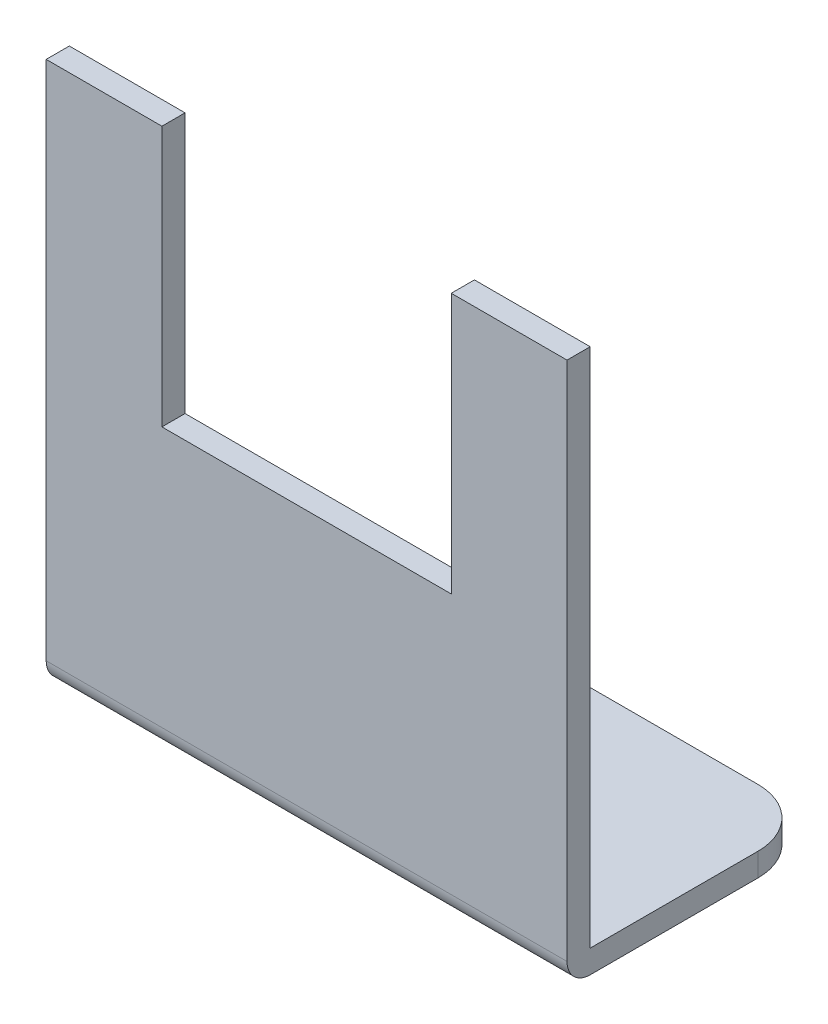
ISO-10303-21;
HEADER;
FILE_DESCRIPTION(('STEP AP214'),'2;1');
FILE_NAME('part.step','',(''),(''),'','','');
FILE_SCHEMA(('AUTOMOTIVE_DESIGN { 1 0 10303 214 1 1 1 1 }'));
ENDSEC;
DATA;
#1=APPLICATION_CONTEXT('core data for automotive mechanical design processes');
#2=APPLICATION_PROTOCOL_DEFINITION('international standard','automotive_design',2000,#1);
#3=PRODUCT_CONTEXT('',#1,'mechanical');
#4=PRODUCT('Part','Part','',(#3));
#5=PRODUCT_RELATED_PRODUCT_CATEGORY('part','',(#4));
#6=PRODUCT_DEFINITION_FORMATION('','',#4);
#7=PRODUCT_DEFINITION_CONTEXT('part definition',#1,'design');
#8=PRODUCT_DEFINITION('design','',#6,#7);
#9=PRODUCT_DEFINITION_SHAPE('','',#8);
#10=(LENGTH_UNIT() NAMED_UNIT(*) SI_UNIT(.MILLI.,.METRE.));
#11=(NAMED_UNIT(*) PLANE_ANGLE_UNIT() SI_UNIT($,.RADIAN.));
#12=(NAMED_UNIT(*) SI_UNIT($,.STERADIAN.) SOLID_ANGLE_UNIT());
#13=UNCERTAINTY_MEASURE_WITH_UNIT(LENGTH_MEASURE(1.E-05),#10,'distance_accuracy_value','');
#14=(GEOMETRIC_REPRESENTATION_CONTEXT(3) GLOBAL_UNCERTAINTY_ASSIGNED_CONTEXT((#13)) GLOBAL_UNIT_ASSIGNED_CONTEXT((#10,
#11,#12)) REPRESENTATION_CONTEXT('',''));
#15=CARTESIAN_POINT('',(0.,0.,0.));
#16=DIRECTION('',(0.,0.,1.));
#17=DIRECTION('',(1.,0.,0.));
#18=AXIS2_PLACEMENT_3D('',#15,#16,#17);
#19=CARTESIAN_POINT('',(0.,0.,0.));
#20=DIRECTION('',(0.,0.,1.));
#21=DIRECTION('',(1.,0.,0.));
#22=AXIS2_PLACEMENT_3D('',#19,#20,#21);
#23=PLANE('',#22);
#24=DIRECTION('',(0.,-1.,0.));
#25=VECTOR('',#24,1.);
#26=CARTESIAN_POINT('',(12.5,0.,0.));
#27=LINE('',#26,#25);
#28=CARTESIAN_POINT('',(12.5,23.5,0.));
#29=VERTEX_POINT('',#28);
#30=CARTESIAN_POINT('',(12.5,0.999999999999997,0.));
#31=VERTEX_POINT('',#30);
#32=EDGE_CURVE('E246',#29,#31,#27,.T.);
#33=ORIENTED_EDGE('',*,*,#32,.F.);
#34=DIRECTION('',(1.,0.,0.));
#35=VECTOR('',#34,1.);
#36=CARTESIAN_POINT('',(-22.5,23.5,0.));
#37=LINE('',#36,#35);
#38=CARTESIAN_POINT('',(22.5,23.5,0.));
#39=VERTEX_POINT('',#38);
#40=EDGE_CURVE('E148',#29,#39,#37,.T.);
#41=ORIENTED_EDGE('',*,*,#40,.T.);
#42=DIRECTION('',(0.,-1.,0.));
#43=VECTOR('',#42,1.);
#44=CARTESIAN_POINT('',(22.5,23.5,0.));
#45=LINE('',#44,#43);
#46=CARTESIAN_POINT('',(22.5,-21.5,0.));
#47=VERTEX_POINT('',#46);
#48=EDGE_CURVE('E167',#39,#47,#45,.T.);
#49=ORIENTED_EDGE('',*,*,#48,.T.);
#50=DIRECTION('',(1.,0.,0.));
#51=VECTOR('',#50,1.);
#52=CARTESIAN_POINT('',(22.5,-21.5,0.));
#53=LINE('',#52,#51);
#54=CARTESIAN_POINT('',(-22.5,-21.5,0.));
#55=VERTEX_POINT('',#54);
#56=EDGE_CURVE('E216',#55,#47,#53,.T.);
#57=ORIENTED_EDGE('',*,*,#56,.F.);
#58=DIRECTION('',(0.,-1.,0.));
#59=VECTOR('',#58,1.);
#60=CARTESIAN_POINT('',(-22.5,23.5,0.));
#61=LINE('',#60,#59);
#62=CARTESIAN_POINT('',(-22.5,23.5,0.));
#63=VERTEX_POINT('',#62);
#64=EDGE_CURVE('E164',#63,#55,#61,.T.);
#65=ORIENTED_EDGE('',*,*,#64,.F.);
#66=CARTESIAN_POINT('',(-12.5,23.5,0.));
#67=VERTEX_POINT('',#66);
#68=EDGE_CURVE('E171',#63,#67,#37,.T.);
#69=ORIENTED_EDGE('',*,*,#68,.T.);
#70=DIRECTION('',(0.,-1.,0.));
#71=VECTOR('',#70,1.);
#72=CARTESIAN_POINT('',(-12.5,0.,0.));
#73=LINE('',#72,#71);
#74=CARTESIAN_POINT('',(-12.5,1.,0.));
#75=VERTEX_POINT('',#74);
#76=EDGE_CURVE('E149',#67,#75,#73,.T.);
#77=ORIENTED_EDGE('',*,*,#76,.T.);
#78=DIRECTION('',(1.,0.,0.));
#79=VECTOR('',#78,1.);
#80=CARTESIAN_POINT('',(0.,0.999999999999999,0.));
#81=LINE('',#80,#79);
#82=EDGE_CURVE('E247',#75,#31,#81,.T.);
#83=ORIENTED_EDGE('',*,*,#82,.T.);
#84=EDGE_LOOP('',(#33,#41,#49,#57,#65,#69,#77,#83));
#85=FACE_BOUND('',#84,.T.);
#86=ADVANCED_FACE('F33',(#85),#23,.F.);
#87=CARTESIAN_POINT('',(-22.5,23.5,2.));
#88=DIRECTION('',(0.,1.,0.));
#89=DIRECTION('',(0.,0.,1.));
#90=AXIS2_PLACEMENT_3D('',#87,#88,#89);
#91=PLANE('',#90);
#92=ORIENTED_EDGE('',*,*,#40,.F.);
#93=DIRECTION('',(0.,0.,1.));
#94=VECTOR('',#93,1.);
#95=CARTESIAN_POINT('',(12.5,23.5,-19.5));
#96=LINE('',#95,#94);
#97=CARTESIAN_POINT('',(12.5,23.5,2.));
#98=VERTEX_POINT('',#97);
#99=EDGE_CURVE('E131',#29,#98,#96,.T.);
#100=ORIENTED_EDGE('',*,*,#99,.T.);
#101=DIRECTION('',(1.,0.,0.));
#102=VECTOR('',#101,1.);
#103=CARTESIAN_POINT('',(-22.5,23.5,2.));
#104=LINE('',#103,#102);
#105=CARTESIAN_POINT('',(22.5,23.5,2.));
#106=VERTEX_POINT('',#105);
#107=EDGE_CURVE('E146',#98,#106,#104,.T.);
#108=ORIENTED_EDGE('',*,*,#107,.T.);
#109=DIRECTION('',(0.,0.,-1.));
#110=VECTOR('',#109,1.);
#111=CARTESIAN_POINT('',(22.5,23.5,2.));
#112=LINE('',#111,#110);
#113=EDGE_CURVE('E175',#106,#39,#112,.T.);
#114=ORIENTED_EDGE('',*,*,#113,.T.);
#115=EDGE_LOOP('',(#92,#100,#108,#114));
#116=FACE_BOUND('',#115,.T.);
#117=ADVANCED_FACE('F144',(#116),#91,.T.);
#118=CARTESIAN_POINT('',(0.,0.,2.));
#119=DIRECTION('',(0.,0.,1.));
#120=DIRECTION('',(1.,0.,0.));
#121=AXIS2_PLACEMENT_3D('',#118,#119,#120);
#122=PLANE('',#121);
#123=ORIENTED_EDGE('',*,*,#107,.F.);
#124=DIRECTION('',(0.,-1.,0.));
#125=VECTOR('',#124,1.);
#126=CARTESIAN_POINT('',(12.5,23.5,2.));
#127=LINE('',#126,#125);
#128=CARTESIAN_POINT('',(12.5,0.999999999999997,2.));
#129=VERTEX_POINT('',#128);
#130=EDGE_CURVE('E128',#98,#129,#127,.T.);
#131=ORIENTED_EDGE('',*,*,#130,.T.);
#132=DIRECTION('',(1.,0.,0.));
#133=VECTOR('',#132,1.);
#134=CARTESIAN_POINT('',(-12.5,1.,2.));
#135=LINE('',#134,#133);
#136=CARTESIAN_POINT('',(-12.5,1.,2.));
#137=VERTEX_POINT('',#136);
#138=EDGE_CURVE('E139',#137,#129,#135,.T.);
#139=ORIENTED_EDGE('',*,*,#138,.F.);
#140=DIRECTION('',(0.,-1.,0.));
#141=VECTOR('',#140,1.);
#142=CARTESIAN_POINT('',(-12.5,23.5,2.));
#143=LINE('',#142,#141);
#144=CARTESIAN_POINT('',(-12.5,23.5,2.));
#145=VERTEX_POINT('',#144);
#146=EDGE_CURVE('E259',#145,#137,#143,.T.);
#147=ORIENTED_EDGE('',*,*,#146,.F.);
#148=CARTESIAN_POINT('',(-22.5,23.5,2.));
#149=VERTEX_POINT('',#148);
#150=EDGE_CURVE('E156',#149,#145,#104,.T.);
#151=ORIENTED_EDGE('',*,*,#150,.F.);
#152=DIRECTION('',(0.,-1.,0.));
#153=VECTOR('',#152,1.);
#154=CARTESIAN_POINT('',(-22.5,23.5,2.));
#155=LINE('',#154,#153);
#156=CARTESIAN_POINT('',(-22.5,-21.5,2.));
#157=VERTEX_POINT('',#156);
#158=EDGE_CURVE('E160',#149,#157,#155,.T.);
#159=ORIENTED_EDGE('',*,*,#158,.T.);
#160=DIRECTION('',(1.,0.,0.));
#161=VECTOR('',#160,1.);
#162=CARTESIAN_POINT('',(22.5,-21.5,2.));
#163=LINE('',#162,#161);
#164=CARTESIAN_POINT('',(22.5,-21.5,2.));
#165=VERTEX_POINT('',#164);
#166=EDGE_CURVE('E182',#157,#165,#163,.T.);
#167=ORIENTED_EDGE('',*,*,#166,.T.);
#168=DIRECTION('',(0.,-1.,0.));
#169=VECTOR('',#168,1.);
#170=CARTESIAN_POINT('',(22.5,23.5,2.));
#171=LINE('',#170,#169);
#172=EDGE_CURVE('E155',#106,#165,#171,.T.);
#173=ORIENTED_EDGE('',*,*,#172,.F.);
#174=EDGE_LOOP('',(#123,#131,#139,#147,#151,#159,#167,#173));
#175=FACE_BOUND('',#174,.T.);
#176=ADVANCED_FACE('F152',(#175),#122,.T.);
#177=CARTESIAN_POINT('',(-22.5,23.5,2.));
#178=DIRECTION('',(1.,0.,0.));
#179=DIRECTION('',(0.,1.,0.));
#180=AXIS2_PLACEMENT_3D('',#177,#178,#179);
#181=PLANE('',#180);
#182=DIRECTION('',(0.,0.,1.));
#183=VECTOR('',#182,1.);
#184=CARTESIAN_POINT('',(-22.5,-21.5,-19.5));
#185=LINE('',#184,#183);
#186=CARTESIAN_POINT('',(-22.5,-21.5,-14.5));
#187=VERTEX_POINT('',#186);
#188=EDGE_CURVE('E168',#187,#55,#185,.T.);
#189=ORIENTED_EDGE('',*,*,#188,.F.);
#190=DIRECTION('',(0.,1.,0.));
#191=VECTOR('',#190,1.);
#192=CARTESIAN_POINT('',(-22.5,23.5,-14.5));
#193=LINE('',#192,#191);
#194=CARTESIAN_POINT('',(-22.5,-23.5,-14.5));
#195=VERTEX_POINT('',#194);
#196=EDGE_CURVE('E200',#187,#195,#193,.F.);
#197=ORIENTED_EDGE('',*,*,#196,.T.);
#198=DIRECTION('',(0.,0.,-1.));
#199=VECTOR('',#198,1.);
#200=CARTESIAN_POINT('',(-22.5,-23.5,2.));
#201=LINE('',#200,#199);
#202=CARTESIAN_POINT('',(-22.5,-23.5,0.));
#203=VERTEX_POINT('',#202);
#204=EDGE_CURVE('E179',#203,#195,#201,.T.);
#205=ORIENTED_EDGE('',*,*,#204,.F.);
#206=CARTESIAN_POINT('',(-22.5,-21.5,0.));
#207=DIRECTION('',(1.,0.,0.));
#208=DIRECTION('',(0.,1.,0.));
#209=AXIS2_PLACEMENT_3D('',#206,#207,#208);
#210=CIRCLE('',#209,2.);
#211=EDGE_CURVE('E188',#203,#157,#210,.F.);
#212=ORIENTED_EDGE('',*,*,#211,.T.);
#213=ORIENTED_EDGE('',*,*,#158,.F.);
#214=DIRECTION('',(0.,0.,-1.));
#215=VECTOR('',#214,1.);
#216=CARTESIAN_POINT('',(-22.5,23.5,2.));
#217=LINE('',#216,#215);
#218=EDGE_CURVE('E159',#149,#63,#217,.T.);
#219=ORIENTED_EDGE('',*,*,#218,.T.);
#220=ORIENTED_EDGE('',*,*,#64,.T.);
#221=EDGE_LOOP('',(#189,#197,#205,#212,#213,#219,#220));
#222=FACE_BOUND('',#221,.T.);
#223=ADVANCED_FACE('F225',(#222),#181,.F.);
#224=CARTESIAN_POINT('',(-22.5,-23.5,2.));
#225=DIRECTION('',(0.,1.,0.));
#226=DIRECTION('',(0.,0.,1.));
#227=AXIS2_PLACEMENT_3D('',#224,#225,#226);
#228=PLANE('',#227);
#229=CARTESIAN_POINT('',(0.,-23.5,-14.5));
#230=DIRECTION('',(0.,1.,0.));
#231=DIRECTION('',(-1.,0.,0.));
#232=AXIS2_PLACEMENT_3D('',#229,#230,#231);
#233=CIRCLE('',#232,1.5);
#234=CARTESIAN_POINT('',(-1.5,-23.5,-14.5));
#235=VERTEX_POINT('',#234);
#236=EDGE_CURVE('E140',#235,#235,#233,.T.);
#237=ORIENTED_EDGE('',*,*,#236,.T.);
#238=EDGE_LOOP('',(#237));
#239=FACE_BOUND('',#238,.T.);
#240=ORIENTED_EDGE('',*,*,#204,.T.);
#241=CARTESIAN_POINT('',(-17.5,-23.5,-14.5));
#242=DIRECTION('',(0.,1.,0.));
#243=DIRECTION('',(0.,0.,1.));
#244=AXIS2_PLACEMENT_3D('',#241,#242,#243);
#245=CIRCLE('',#244,5.);
#246=CARTESIAN_POINT('',(-17.5,-23.5,-19.5));
#247=VERTEX_POINT('',#246);
#248=EDGE_CURVE('E41',#195,#247,#245,.F.);
#249=ORIENTED_EDGE('',*,*,#248,.T.);
#250=DIRECTION('',(-1.,0.,0.));
#251=VECTOR('',#250,1.);
#252=CARTESIAN_POINT('',(22.5,-23.5,-19.5));
#253=LINE('',#252,#251);
#254=CARTESIAN_POINT('',(17.5,-23.5,-19.5));
#255=VERTEX_POINT('',#254);
#256=EDGE_CURVE('E205',#255,#247,#253,.T.);
#257=ORIENTED_EDGE('',*,*,#256,.F.);
#258=CARTESIAN_POINT('',(17.5,-23.5,-14.5));
#259=DIRECTION('',(0.,1.,0.));
#260=DIRECTION('',(0.,0.,1.));
#261=AXIS2_PLACEMENT_3D('',#258,#259,#260);
#262=CIRCLE('',#261,5.);
#263=CARTESIAN_POINT('',(22.5,-23.5,-14.5));
#264=VERTEX_POINT('',#263);
#265=EDGE_CURVE('E56',#255,#264,#262,.F.);
#266=ORIENTED_EDGE('',*,*,#265,.T.);
#267=DIRECTION('',(0.,0.,-1.));
#268=VECTOR('',#267,1.);
#269=CARTESIAN_POINT('',(22.5,-23.5,2.));
#270=LINE('',#269,#268);
#271=CARTESIAN_POINT('',(22.5,-23.5,0.));
#272=VERTEX_POINT('',#271);
#273=EDGE_CURVE('E177',#272,#264,#270,.T.);
#274=ORIENTED_EDGE('',*,*,#273,.F.);
#275=DIRECTION('',(1.,0.,0.));
#276=VECTOR('',#275,1.);
#277=CARTESIAN_POINT('',(-22.5,-23.5,0.));
#278=LINE('',#277,#276);
#279=EDGE_CURVE('E186',#272,#203,#278,.F.);
#280=ORIENTED_EDGE('',*,*,#279,.T.);
#281=EDGE_LOOP('',(#240,#249,#257,#266,#274,#280));
#282=FACE_BOUND('',#281,.T.);
#283=ADVANCED_FACE('F204',(#239,#282),#228,.F.);
#284=CARTESIAN_POINT('',(22.5,23.5,2.));
#285=DIRECTION('',(1.,0.,0.));
#286=DIRECTION('',(0.,1.,0.));
#287=AXIS2_PLACEMENT_3D('',#284,#285,#286);
#288=PLANE('',#287);
#289=ORIENTED_EDGE('',*,*,#273,.T.);
#290=DIRECTION('',(0.,-1.,0.));
#291=VECTOR('',#290,1.);
#292=CARTESIAN_POINT('',(22.5,-21.5,-14.5));
#293=LINE('',#292,#291);
#294=CARTESIAN_POINT('',(22.5,-21.5,-14.5));
#295=VERTEX_POINT('',#294);
#296=EDGE_CURVE('E11',#264,#295,#293,.F.);
#297=ORIENTED_EDGE('',*,*,#296,.T.);
#298=DIRECTION('',(0.,0.,1.));
#299=VECTOR('',#298,1.);
#300=CARTESIAN_POINT('',(22.5,-21.5,-19.5));
#301=LINE('',#300,#299);
#302=EDGE_CURVE('E227',#295,#47,#301,.T.);
#303=ORIENTED_EDGE('',*,*,#302,.T.);
#304=ORIENTED_EDGE('',*,*,#48,.F.);
#305=ORIENTED_EDGE('',*,*,#113,.F.);
#306=ORIENTED_EDGE('',*,*,#172,.T.);
#307=CARTESIAN_POINT('',(22.5,-21.5,0.));
#308=DIRECTION('',(1.,0.,0.));
#309=DIRECTION('',(0.,1.,0.));
#310=AXIS2_PLACEMENT_3D('',#307,#308,#309);
#311=CIRCLE('',#310,2.);
#312=EDGE_CURVE('E184',#165,#272,#311,.T.);
#313=ORIENTED_EDGE('',*,*,#312,.T.);
#314=EDGE_LOOP('',(#289,#297,#303,#304,#305,#306,#313));
#315=FACE_BOUND('',#314,.T.);
#316=ADVANCED_FACE('F240',(#315),#288,.T.);
#317=DIRECTION('',(0.,0.,1.));
#318=VECTOR('',#317,1.);
#319=CARTESIAN_POINT('',(-12.5,23.5,-19.5));
#320=LINE('',#319,#318);
#321=EDGE_CURVE('E48',#67,#145,#320,.T.);
#322=ORIENTED_EDGE('',*,*,#321,.F.);
#323=ORIENTED_EDGE('',*,*,#68,.F.);
#324=ORIENTED_EDGE('',*,*,#218,.F.);
#325=ORIENTED_EDGE('',*,*,#150,.T.);
#326=EDGE_LOOP('',(#322,#323,#324,#325));
#327=FACE_BOUND('',#326,.T.);
#328=ADVANCED_FACE('F277',(#327),#91,.T.);
#329=CARTESIAN_POINT('',(22.5,-21.5,-19.5));
#330=DIRECTION('',(0.,-1.,0.));
#331=DIRECTION('',(1.,0.,0.));
#332=AXIS2_PLACEMENT_3D('',#329,#330,#331);
#333=PLANE('',#332);
#334=CARTESIAN_POINT('',(0.,-21.5,-14.5));
#335=DIRECTION('',(0.,1.,0.));
#336=DIRECTION('',(-1.,0.,0.));
#337=AXIS2_PLACEMENT_3D('',#334,#335,#336);
#338=CIRCLE('',#337,1.5);
#339=CARTESIAN_POINT('',(-1.5,-21.5,-14.5));
#340=VERTEX_POINT('',#339);
#341=EDGE_CURVE('E262',#340,#340,#338,.T.);
#342=ORIENTED_EDGE('',*,*,#341,.F.);
#343=EDGE_LOOP('',(#342));
#344=FACE_BOUND('',#343,.T.);
#345=DIRECTION('',(1.,0.,0.));
#346=VECTOR('',#345,1.);
#347=CARTESIAN_POINT('',(22.5,-21.5,-19.5));
#348=LINE('',#347,#346);
#349=CARTESIAN_POINT('',(-17.5,-21.5,-19.5));
#350=VERTEX_POINT('',#349);
#351=CARTESIAN_POINT('',(17.5,-21.5,-19.5));
#352=VERTEX_POINT('',#351);
#353=EDGE_CURVE('E215',#350,#352,#348,.T.);
#354=ORIENTED_EDGE('',*,*,#353,.F.);
#355=CARTESIAN_POINT('',(-17.5,-21.5,-14.5));
#356=DIRECTION('',(0.,-1.,0.));
#357=DIRECTION('',(1.,0.,0.));
#358=AXIS2_PLACEMENT_3D('',#355,#356,#357);
#359=CIRCLE('',#358,5.);
#360=EDGE_CURVE('E198',#350,#187,#359,.F.);
#361=ORIENTED_EDGE('',*,*,#360,.T.);
#362=ORIENTED_EDGE('',*,*,#188,.T.);
#363=ORIENTED_EDGE('',*,*,#56,.T.);
#364=ORIENTED_EDGE('',*,*,#302,.F.);
#365=CARTESIAN_POINT('',(17.5,-21.5,-14.5));
#366=DIRECTION('',(0.,-1.,0.));
#367=DIRECTION('',(1.,0.,0.));
#368=AXIS2_PLACEMENT_3D('',#365,#366,#367);
#369=CIRCLE('',#368,5.);
#370=EDGE_CURVE('E196',#295,#352,#369,.F.);
#371=ORIENTED_EDGE('',*,*,#370,.T.);
#372=EDGE_LOOP('',(#354,#361,#362,#363,#364,#371));
#373=FACE_BOUND('',#372,.T.);
#374=ADVANCED_FACE('F221',(#344,#373),#333,.F.);
#375=CARTESIAN_POINT('',(0.,0.,-19.5));
#376=DIRECTION('',(0.,0.,1.));
#377=DIRECTION('',(1.,0.,0.));
#378=AXIS2_PLACEMENT_3D('',#375,#376,#377);
#379=PLANE('',#378);
#380=ORIENTED_EDGE('',*,*,#256,.T.);
#381=DIRECTION('',(0.,1.,0.));
#382=VECTOR('',#381,1.);
#383=CARTESIAN_POINT('',(-17.5,0.,-19.5));
#384=LINE('',#383,#382);
#385=EDGE_CURVE('E193',#247,#350,#384,.T.);
#386=ORIENTED_EDGE('',*,*,#385,.T.);
#387=ORIENTED_EDGE('',*,*,#353,.T.);
#388=DIRECTION('',(0.,-1.,0.));
#389=VECTOR('',#388,1.);
#390=CARTESIAN_POINT('',(17.5,-23.5,-19.5));
#391=LINE('',#390,#389);
#392=EDGE_CURVE('E190',#352,#255,#391,.T.);
#393=ORIENTED_EDGE('',*,*,#392,.T.);
#394=EDGE_LOOP('',(#380,#386,#387,#393));
#395=FACE_BOUND('',#394,.T.);
#396=ADVANCED_FACE('F211',(#395),#379,.F.);
#397=CARTESIAN_POINT('',(0.,-21.5,0.));
#398=DIRECTION('',(-1.,0.,0.));
#399=DIRECTION('',(0.,0.,1.));
#400=AXIS2_PLACEMENT_3D('',#397,#398,#399);
#401=CYLINDRICAL_SURFACE('',#400,2.);
#402=ORIENTED_EDGE('',*,*,#211,.F.);
#403=ORIENTED_EDGE('',*,*,#279,.F.);
#404=ORIENTED_EDGE('',*,*,#312,.F.);
#405=ORIENTED_EDGE('',*,*,#166,.F.);
#406=EDGE_LOOP('',(#402,#403,#404,#405));
#407=FACE_BOUND('',#406,.T.);
#408=ADVANCED_FACE('F237',(#407),#401,.T.);
#409=CARTESIAN_POINT('',(-17.5,0.,-14.5));
#410=DIRECTION('',(0.,1.,0.));
#411=DIRECTION('',(-1.,0.,0.));
#412=AXIS2_PLACEMENT_3D('',#409,#410,#411);
#413=CYLINDRICAL_SURFACE('',#412,5.);
#414=ORIENTED_EDGE('',*,*,#248,.F.);
#415=ORIENTED_EDGE('',*,*,#196,.F.);
#416=ORIENTED_EDGE('',*,*,#360,.F.);
#417=ORIENTED_EDGE('',*,*,#385,.F.);
#418=EDGE_LOOP('',(#414,#415,#416,#417));
#419=FACE_BOUND('',#418,.T.);
#420=ADVANCED_FACE('F218',(#419),#413,.T.);
#421=CARTESIAN_POINT('',(17.5,0.,-14.5));
#422=DIRECTION('',(0.,1.,0.));
#423=DIRECTION('',(-1.,0.,0.));
#424=AXIS2_PLACEMENT_3D('',#421,#422,#423);
#425=CYLINDRICAL_SURFACE('',#424,5.);
#426=ORIENTED_EDGE('',*,*,#370,.F.);
#427=ORIENTED_EDGE('',*,*,#296,.F.);
#428=ORIENTED_EDGE('',*,*,#265,.F.);
#429=ORIENTED_EDGE('',*,*,#392,.F.);
#430=EDGE_LOOP('',(#426,#427,#428,#429));
#431=FACE_BOUND('',#430,.T.);
#432=ADVANCED_FACE('F35',(#431),#425,.T.);
#433=CARTESIAN_POINT('',(12.5,23.5,-19.5));
#434=DIRECTION('',(-1.,0.,0.));
#435=DIRECTION('',(0.,-1.,0.));
#436=AXIS2_PLACEMENT_3D('',#433,#434,#435);
#437=PLANE('',#436);
#438=ORIENTED_EDGE('',*,*,#32,.T.);
#439=DIRECTION('',(0.,0.,1.));
#440=VECTOR('',#439,1.);
#441=CARTESIAN_POINT('',(12.5,0.999999999999997,-19.5));
#442=LINE('',#441,#440);
#443=EDGE_CURVE('E134',#31,#129,#442,.T.);
#444=ORIENTED_EDGE('',*,*,#443,.T.);
#445=ORIENTED_EDGE('',*,*,#130,.F.);
#446=ORIENTED_EDGE('',*,*,#99,.F.);
#447=EDGE_LOOP('',(#438,#444,#445,#446));
#448=FACE_BOUND('',#447,.T.);
#449=ADVANCED_FACE('F130',(#448),#437,.T.);
#450=CARTESIAN_POINT('',(-12.5,1.,-19.5));
#451=DIRECTION('',(0.,-1.,0.));
#452=DIRECTION('',(1.,0.,0.));
#453=AXIS2_PLACEMENT_3D('',#450,#451,#452);
#454=PLANE('',#453);
#455=DIRECTION('',(0.,0.,1.));
#456=VECTOR('',#455,1.);
#457=CARTESIAN_POINT('',(-12.5,1.,-19.5));
#458=LINE('',#457,#456);
#459=EDGE_CURVE('E256',#75,#137,#458,.T.);
#460=ORIENTED_EDGE('',*,*,#459,.T.);
#461=ORIENTED_EDGE('',*,*,#138,.T.);
#462=ORIENTED_EDGE('',*,*,#443,.F.);
#463=ORIENTED_EDGE('',*,*,#82,.F.);
#464=EDGE_LOOP('',(#460,#461,#462,#463));
#465=FACE_BOUND('',#464,.T.);
#466=ADVANCED_FACE('F309',(#465),#454,.F.);
#467=CARTESIAN_POINT('',(-12.5,23.5,-19.5));
#468=DIRECTION('',(-1.,0.,0.));
#469=DIRECTION('',(0.,-1.,0.));
#470=AXIS2_PLACEMENT_3D('',#467,#468,#469);
#471=PLANE('',#470);
#472=ORIENTED_EDGE('',*,*,#321,.T.);
#473=ORIENTED_EDGE('',*,*,#146,.T.);
#474=ORIENTED_EDGE('',*,*,#459,.F.);
#475=ORIENTED_EDGE('',*,*,#76,.F.);
#476=EDGE_LOOP('',(#472,#473,#474,#475));
#477=FACE_BOUND('',#476,.T.);
#478=ADVANCED_FACE('F272',(#477),#471,.F.);
#479=CARTESIAN_POINT('',(0.,-23.5,-14.5));
#480=DIRECTION('',(0.,1.,0.));
#481=DIRECTION('',(-1.,0.,0.));
#482=AXIS2_PLACEMENT_3D('',#479,#480,#481);
#483=CYLINDRICAL_SURFACE('',#482,1.5);
#484=ORIENTED_EDGE('',*,*,#236,.F.);
#485=EDGE_LOOP('',(#484));
#486=FACE_BOUND('',#485,.T.);
#487=ORIENTED_EDGE('',*,*,#341,.T.);
#488=EDGE_LOOP('',(#487));
#489=FACE_BOUND('',#488,.T.);
#490=ADVANCED_FACE('F269',(#486,#489),#483,.F.);
#491=CLOSED_SHELL('',(#86,#117,#176,#223,#283,#316,#328,#374,#396,#408,#420,#432,#449,#466,#478,#490));
#492=MANIFOLD_SOLID_BREP('B2',#491);
#493=ADVANCED_BREP_SHAPE_REPRESENTATION('',(#18,#492),#14);
#494=SHAPE_DEFINITION_REPRESENTATION(#9,#493);
ENDSEC;
END-ISO-10303-21;
